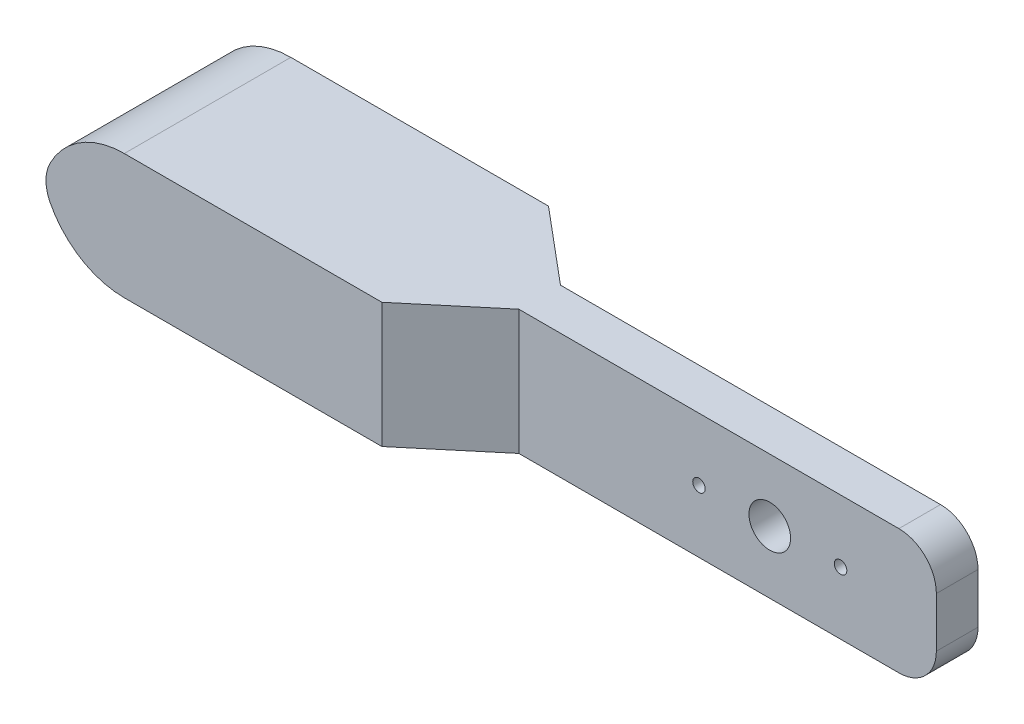
ISO-10303-21;
HEADER;
FILE_DESCRIPTION(('STEP AP214'),'2;1');
FILE_NAME('part.step','',(''),(''),'','','');
FILE_SCHEMA(('AUTOMOTIVE_DESIGN { 1 0 10303 214 1 1 1 1 }'));
ENDSEC;
DATA;
#1=APPLICATION_CONTEXT('core data for automotive mechanical design processes');
#2=APPLICATION_PROTOCOL_DEFINITION('international standard','automotive_design',2000,#1);
#3=PRODUCT_CONTEXT('',#1,'mechanical');
#4=PRODUCT('Part','Part','',(#3));
#5=PRODUCT_RELATED_PRODUCT_CATEGORY('part','',(#4));
#6=PRODUCT_DEFINITION_FORMATION('','',#4);
#7=PRODUCT_DEFINITION_CONTEXT('part definition',#1,'design');
#8=PRODUCT_DEFINITION('design','',#6,#7);
#9=PRODUCT_DEFINITION_SHAPE('','',#8);
#10=(LENGTH_UNIT() NAMED_UNIT(*) SI_UNIT(.MILLI.,.METRE.));
#11=(NAMED_UNIT(*) PLANE_ANGLE_UNIT() SI_UNIT($,.RADIAN.));
#12=(NAMED_UNIT(*) SI_UNIT($,.STERADIAN.) SOLID_ANGLE_UNIT());
#13=UNCERTAINTY_MEASURE_WITH_UNIT(LENGTH_MEASURE(1.E-05),#10,'distance_accuracy_value','');
#14=(GEOMETRIC_REPRESENTATION_CONTEXT(3) GLOBAL_UNCERTAINTY_ASSIGNED_CONTEXT((#13)) GLOBAL_UNIT_ASSIGNED_CONTEXT((#10,
#11,#12)) REPRESENTATION_CONTEXT('',''));
#15=CARTESIAN_POINT('',(0.,0.,0.));
#16=DIRECTION('',(0.,0.,1.));
#17=DIRECTION('',(1.,0.,0.));
#18=AXIS2_PLACEMENT_3D('',#15,#16,#17);
#19=CARTESIAN_POINT('',(0.,-6.,3.));
#20=DIRECTION('',(0.,-1.,0.));
#21=DIRECTION('',(0.,0.,1.));
#22=AXIS2_PLACEMENT_3D('',#19,#20,#21);
#23=PLANE('',#22);
#24=DIRECTION('',(1.,0.,0.));
#25=VECTOR('',#24,1.);
#26=CARTESIAN_POINT('',(0.,-6.,3.));
#27=LINE('',#26,#25);
#28=CARTESIAN_POINT('',(-27.629905537051,-6.,3.));
#29=VERTEX_POINT('',#28);
#30=CARTESIAN_POINT('',(18.,-6.,3.));
#31=VERTEX_POINT('',#30);
#32=EDGE_CURVE('E149',#29,#31,#27,.T.);
#33=ORIENTED_EDGE('',*,*,#32,.F.);
#34=DIRECTION('',(0.766044443118981,0.,-0.642787609686536));
#35=VECTOR('',#34,1.);
#36=CARTESIAN_POINT('',(-11.4160113957162,-6.,-10.6050725939414));
#37=LINE('',#36,#35);
#38=CARTESIAN_POINT('',(-36.5680574815077,-6.,10.5));
#39=VERTEX_POINT('',#38);
#40=EDGE_CURVE('E127',#39,#29,#37,.T.);
#41=ORIENTED_EDGE('',*,*,#40,.F.);
#42=DIRECTION('',(1.,0.,0.));
#43=VECTOR('',#42,1.);
#44=CARTESIAN_POINT('',(-77.5,-6.,10.5));
#45=LINE('',#44,#43);
#46=CARTESIAN_POINT('',(-67.5,-6.,10.5));
#47=VERTEX_POINT('',#46);
#48=EDGE_CURVE('E138',#47,#39,#45,.T.);
#49=ORIENTED_EDGE('',*,*,#48,.F.);
#50=DIRECTION('',(0.,0.,-1.));
#51=VECTOR('',#50,1.);
#52=CARTESIAN_POINT('',(-67.5,-6.,10.5));
#53=LINE('',#52,#51);
#54=CARTESIAN_POINT('',(-67.5,-6.,-9.5));
#55=VERTEX_POINT('',#54);
#56=EDGE_CURVE('E175',#55,#47,#53,.F.);
#57=ORIENTED_EDGE('',*,*,#56,.F.);
#58=DIRECTION('',(1.,0.,0.));
#59=VECTOR('',#58,1.);
#60=CARTESIAN_POINT('',(-77.5,-6.,-9.5));
#61=LINE('',#60,#59);
#62=CARTESIAN_POINT('',(-36.5680574815077,-6.,-9.5));
#63=VERTEX_POINT('',#62);
#64=EDGE_CURVE('E145',#55,#63,#61,.T.);
#65=ORIENTED_EDGE('',*,*,#64,.T.);
#66=DIRECTION('',(-0.766044443118981,0.,-0.642787609686536));
#67=VECTOR('',#66,1.);
#68=CARTESIAN_POINT('',(-8.9539920131857,-6.,13.670952149774));
#69=LINE('',#68,#67);
#70=CARTESIAN_POINT('',(-27.629905537051,-6.,-2.));
#71=VERTEX_POINT('',#70);
#72=EDGE_CURVE('E134',#71,#63,#69,.T.);
#73=ORIENTED_EDGE('',*,*,#72,.F.);
#74=DIRECTION('',(1.,0.,0.));
#75=VECTOR('',#74,1.);
#76=CARTESIAN_POINT('',(-17.5,-6.,-2.));
#77=LINE('',#76,#75);
#78=CARTESIAN_POINT('',(18.,-6.,-2.));
#79=VERTEX_POINT('',#78);
#80=EDGE_CURVE('E223',#71,#79,#77,.T.);
#81=ORIENTED_EDGE('',*,*,#80,.T.);
#82=DIRECTION('',(0.,0.,-1.));
#83=VECTOR('',#82,1.);
#84=CARTESIAN_POINT('',(18.,-6.,3.));
#85=LINE('',#84,#83);
#86=EDGE_CURVE('E177',#31,#79,#85,.T.);
#87=ORIENTED_EDGE('',*,*,#86,.F.);
#88=EDGE_LOOP('',(#33,#41,#49,#57,#65,#73,#81,#87));
#89=FACE_BOUND('',#88,.T.);
#90=ADVANCED_FACE('F37',(#89),#23,.T.);
#91=CARTESIAN_POINT('',(0.,9.,3.));
#92=DIRECTION('',(0.,-1.,0.));
#93=DIRECTION('',(0.,0.,1.));
#94=AXIS2_PLACEMENT_3D('',#91,#92,#93);
#95=PLANE('',#94);
#96=DIRECTION('',(-1.,0.,0.));
#97=VECTOR('',#96,1.);
#98=CARTESIAN_POINT('',(-17.5,9.,-2.));
#99=LINE('',#98,#97);
#100=CARTESIAN_POINT('',(18.,9.,-2.));
#101=VERTEX_POINT('',#100);
#102=CARTESIAN_POINT('',(-27.629905537051,9.,-2.));
#103=VERTEX_POINT('',#102);
#104=EDGE_CURVE('E232',#101,#103,#99,.T.);
#105=ORIENTED_EDGE('',*,*,#104,.T.);
#106=DIRECTION('',(0.766044443118981,0.,0.642787609686536));
#107=VECTOR('',#106,1.);
#108=CARTESIAN_POINT('',(-36.5680574815077,9.,-9.5));
#109=LINE('',#108,#107);
#110=CARTESIAN_POINT('',(-36.5680574815077,9.,-9.5));
#111=VERTEX_POINT('',#110);
#112=EDGE_CURVE('E150',#111,#103,#109,.T.);
#113=ORIENTED_EDGE('',*,*,#112,.F.);
#114=DIRECTION('',(1.,0.,0.));
#115=VECTOR('',#114,1.);
#116=CARTESIAN_POINT('',(-77.5,9.,-9.5));
#117=LINE('',#116,#115);
#118=CARTESIAN_POINT('',(-67.5,9.,-9.5));
#119=VERTEX_POINT('',#118);
#120=EDGE_CURVE('E209',#119,#111,#117,.T.);
#121=ORIENTED_EDGE('',*,*,#120,.F.);
#122=DIRECTION('',(0.,0.,1.));
#123=VECTOR('',#122,1.);
#124=CARTESIAN_POINT('',(-67.5,9.,3.));
#125=LINE('',#124,#123);
#126=CARTESIAN_POINT('',(-67.5,9.,10.5));
#127=VERTEX_POINT('',#126);
#128=EDGE_CURVE('E167',#127,#119,#125,.F.);
#129=ORIENTED_EDGE('',*,*,#128,.F.);
#130=DIRECTION('',(1.,0.,0.));
#131=VECTOR('',#130,1.);
#132=CARTESIAN_POINT('',(-77.5,9.,10.5));
#133=LINE('',#132,#131);
#134=CARTESIAN_POINT('',(-36.5680574815077,9.,10.5));
#135=VERTEX_POINT('',#134);
#136=EDGE_CURVE('E212',#127,#135,#133,.T.);
#137=ORIENTED_EDGE('',*,*,#136,.T.);
#138=DIRECTION('',(-0.766044443118981,0.,0.642787609686536));
#139=VECTOR('',#138,1.);
#140=CARTESIAN_POINT('',(-36.5680574815077,9.,10.5));
#141=LINE('',#140,#139);
#142=CARTESIAN_POINT('',(-27.629905537051,9.,3.));
#143=VERTEX_POINT('',#142);
#144=EDGE_CURVE('E130',#143,#135,#141,.T.);
#145=ORIENTED_EDGE('',*,*,#144,.F.);
#146=DIRECTION('',(1.,0.,0.));
#147=VECTOR('',#146,1.);
#148=CARTESIAN_POINT('',(0.,9.,3.));
#149=LINE('',#148,#147);
#150=CARTESIAN_POINT('',(18.,9.,3.));
#151=VERTEX_POINT('',#150);
#152=EDGE_CURVE('E135',#143,#151,#149,.T.);
#153=ORIENTED_EDGE('',*,*,#152,.T.);
#154=DIRECTION('',(0.,0.,-1.));
#155=VECTOR('',#154,1.);
#156=CARTESIAN_POINT('',(18.,9.,3.));
#157=LINE('',#156,#155);
#158=EDGE_CURVE('E194',#101,#151,#157,.F.);
#159=ORIENTED_EDGE('',*,*,#158,.F.);
#160=EDGE_LOOP('',(#105,#113,#121,#129,#137,#145,#153,#159));
#161=FACE_BOUND('',#160,.T.);
#162=ADVANCED_FACE('F243',(#161),#95,.F.);
#163=CARTESIAN_POINT('',(22.5,0.,3.));
#164=DIRECTION('',(1.,0.,0.));
#165=DIRECTION('',(0.,0.,1.));
#166=AXIS2_PLACEMENT_3D('',#163,#164,#165);
#167=PLANE('',#166);
#168=DIRECTION('',(0.,1.,0.));
#169=VECTOR('',#168,1.);
#170=CARTESIAN_POINT('',(22.5,-6.,-2.));
#171=LINE('',#170,#169);
#172=CARTESIAN_POINT('',(22.5,-1.5,-2.));
#173=VERTEX_POINT('',#172);
#174=CARTESIAN_POINT('',(22.5,4.5,-2.));
#175=VERTEX_POINT('',#174);
#176=EDGE_CURVE('E229',#173,#175,#171,.T.);
#177=ORIENTED_EDGE('',*,*,#176,.T.);
#178=DIRECTION('',(0.,0.,-1.));
#179=VECTOR('',#178,1.);
#180=CARTESIAN_POINT('',(22.5,4.5,-2.));
#181=LINE('',#180,#179);
#182=CARTESIAN_POINT('',(22.5,4.5,3.));
#183=VERTEX_POINT('',#182);
#184=EDGE_CURVE('E184',#183,#175,#181,.T.);
#185=ORIENTED_EDGE('',*,*,#184,.F.);
#186=DIRECTION('',(0.,1.,0.));
#187=VECTOR('',#186,1.);
#188=CARTESIAN_POINT('',(22.5,0.,3.));
#189=LINE('',#188,#187);
#190=CARTESIAN_POINT('',(22.5,-1.5,3.));
#191=VERTEX_POINT('',#190);
#192=EDGE_CURVE('E236',#191,#183,#189,.T.);
#193=ORIENTED_EDGE('',*,*,#192,.F.);
#194=DIRECTION('',(0.,0.,-1.));
#195=VECTOR('',#194,1.);
#196=CARTESIAN_POINT('',(22.5,-1.5,3.));
#197=LINE('',#196,#195);
#198=EDGE_CURVE('E187',#173,#191,#197,.F.);
#199=ORIENTED_EDGE('',*,*,#198,.F.);
#200=EDGE_LOOP('',(#177,#185,#193,#199));
#201=FACE_BOUND('',#200,.T.);
#202=ADVANCED_FACE('F288',(#201),#167,.T.);
#203=CARTESIAN_POINT('',(0.,0.,3.));
#204=DIRECTION('',(0.,0.,-1.));
#205=DIRECTION('',(1.,0.,0.));
#206=AXIS2_PLACEMENT_3D('',#203,#204,#205);
#207=PLANE('',#206);
#208=CARTESIAN_POINT('',(11.,1.5,3.));
#209=DIRECTION('',(0.,0.,1.));
#210=DIRECTION('',(1.,0.,0.));
#211=AXIS2_PLACEMENT_3D('',#208,#209,#210);
#212=CIRCLE('',#211,0.75);
#213=CARTESIAN_POINT('',(11.75,1.5,3.));
#214=VERTEX_POINT('',#213);
#215=EDGE_CURVE('E265',#214,#214,#212,.F.);
#216=ORIENTED_EDGE('',*,*,#215,.T.);
#217=EDGE_LOOP('',(#216));
#218=FACE_BOUND('',#217,.T.);
#219=CARTESIAN_POINT('',(2.5,1.5,3.));
#220=DIRECTION('',(0.,0.,1.));
#221=DIRECTION('',(1.,0.,0.));
#222=AXIS2_PLACEMENT_3D('',#219,#220,#221);
#223=CIRCLE('',#222,2.5);
#224=CARTESIAN_POINT('',(5.,1.5,3.));
#225=VERTEX_POINT('',#224);
#226=EDGE_CURVE('E216',#225,#225,#223,.F.);
#227=ORIENTED_EDGE('',*,*,#226,.T.);
#228=EDGE_LOOP('',(#227));
#229=FACE_BOUND('',#228,.T.);
#230=CARTESIAN_POINT('',(-6.,1.5,3.));
#231=DIRECTION('',(0.,0.,1.));
#232=DIRECTION('',(1.,0.,0.));
#233=AXIS2_PLACEMENT_3D('',#230,#231,#232);
#234=CIRCLE('',#233,0.75);
#235=CARTESIAN_POINT('',(-5.25,1.5,3.));
#236=VERTEX_POINT('',#235);
#237=EDGE_CURVE('E144',#236,#236,#234,.F.);
#238=ORIENTED_EDGE('',*,*,#237,.T.);
#239=EDGE_LOOP('',(#238));
#240=FACE_BOUND('',#239,.T.);
#241=ORIENTED_EDGE('',*,*,#192,.T.);
#242=CARTESIAN_POINT('',(18.,4.5,3.));
#243=DIRECTION('',(0.,0.,1.));
#244=DIRECTION('',(1.,0.,0.));
#245=AXIS2_PLACEMENT_3D('',#242,#243,#244);
#246=CIRCLE('',#245,4.5);
#247=EDGE_CURVE('E190',#151,#183,#246,.F.);
#248=ORIENTED_EDGE('',*,*,#247,.F.);
#249=ORIENTED_EDGE('',*,*,#152,.F.);
#250=DIRECTION('',(0.,1.,0.));
#251=VECTOR('',#250,1.);
#252=CARTESIAN_POINT('',(-27.629905537051,0.,3.));
#253=LINE('',#252,#251);
#254=EDGE_CURVE('E160',#29,#143,#253,.T.);
#255=ORIENTED_EDGE('',*,*,#254,.F.);
#256=ORIENTED_EDGE('',*,*,#32,.T.);
#257=CARTESIAN_POINT('',(18.,-1.5,3.));
#258=DIRECTION('',(0.,0.,1.));
#259=DIRECTION('',(1.,0.,0.));
#260=AXIS2_PLACEMENT_3D('',#257,#258,#259);
#261=CIRCLE('',#260,4.5);
#262=EDGE_CURVE('E192',#191,#31,#261,.F.);
#263=ORIENTED_EDGE('',*,*,#262,.F.);
#264=EDGE_LOOP('',(#241,#248,#249,#255,#256,#263));
#265=FACE_BOUND('',#264,.T.);
#266=ADVANCED_FACE('F246',(#218,#229,#240,#265),#207,.F.);
#267=CARTESIAN_POINT('',(0.,0.,-2.));
#268=DIRECTION('',(0.,0.,1.));
#269=DIRECTION('',(-1.,0.,0.));
#270=AXIS2_PLACEMENT_3D('',#267,#268,#269);
#271=PLANE('',#270);
#272=CARTESIAN_POINT('',(11.,1.5,-2.));
#273=DIRECTION('',(0.,0.,-1.));
#274=DIRECTION('',(-1.,0.,0.));
#275=AXIS2_PLACEMENT_3D('',#272,#273,#274);
#276=CIRCLE('',#275,0.75);
#277=CARTESIAN_POINT('',(10.25,1.5,-2.));
#278=VERTEX_POINT('',#277);
#279=EDGE_CURVE('E263',#278,#278,#276,.T.);
#280=ORIENTED_EDGE('',*,*,#279,.F.);
#281=EDGE_LOOP('',(#280));
#282=FACE_BOUND('',#281,.T.);
#283=CARTESIAN_POINT('',(2.5,1.5,-2.));
#284=DIRECTION('',(0.,0.,-1.));
#285=DIRECTION('',(-1.,0.,0.));
#286=AXIS2_PLACEMENT_3D('',#283,#284,#285);
#287=CIRCLE('',#286,2.5);
#288=CARTESIAN_POINT('',(0.,1.5,-2.));
#289=VERTEX_POINT('',#288);
#290=EDGE_CURVE('E219',#289,#289,#287,.T.);
#291=ORIENTED_EDGE('',*,*,#290,.F.);
#292=EDGE_LOOP('',(#291));
#293=FACE_BOUND('',#292,.T.);
#294=CARTESIAN_POINT('',(-6.,1.5,-2.));
#295=DIRECTION('',(0.,0.,-1.));
#296=DIRECTION('',(-1.,0.,0.));
#297=AXIS2_PLACEMENT_3D('',#294,#295,#296);
#298=CIRCLE('',#297,0.75);
#299=CARTESIAN_POINT('',(-6.75,1.5,-2.));
#300=VERTEX_POINT('',#299);
#301=EDGE_CURVE('E220',#300,#300,#298,.T.);
#302=ORIENTED_EDGE('',*,*,#301,.F.);
#303=EDGE_LOOP('',(#302));
#304=FACE_BOUND('',#303,.T.);
#305=ORIENTED_EDGE('',*,*,#80,.F.);
#306=DIRECTION('',(0.,-1.,0.));
#307=VECTOR('',#306,1.);
#308=CARTESIAN_POINT('',(-27.629905537051,0.,-2.));
#309=LINE('',#308,#307);
#310=EDGE_CURVE('E162',#103,#71,#309,.T.);
#311=ORIENTED_EDGE('',*,*,#310,.F.);
#312=ORIENTED_EDGE('',*,*,#104,.F.);
#313=CARTESIAN_POINT('',(18.,4.5,-2.));
#314=DIRECTION('',(0.,0.,-1.));
#315=DIRECTION('',(-1.,0.,0.));
#316=AXIS2_PLACEMENT_3D('',#313,#314,#315);
#317=CIRCLE('',#316,4.5);
#318=EDGE_CURVE('E180',#175,#101,#317,.F.);
#319=ORIENTED_EDGE('',*,*,#318,.F.);
#320=ORIENTED_EDGE('',*,*,#176,.F.);
#321=CARTESIAN_POINT('',(18.,-1.5,-2.));
#322=DIRECTION('',(0.,0.,-1.));
#323=DIRECTION('',(-1.,0.,0.));
#324=AXIS2_PLACEMENT_3D('',#321,#322,#323);
#325=CIRCLE('',#324,4.5);
#326=EDGE_CURVE('E182',#79,#173,#325,.F.);
#327=ORIENTED_EDGE('',*,*,#326,.F.);
#328=EDGE_LOOP('',(#305,#311,#312,#319,#320,#327));
#329=FACE_BOUND('',#328,.T.);
#330=ADVANCED_FACE('F254',(#282,#293,#304,#329),#271,.F.);
#331=CARTESIAN_POINT('',(-6.,1.5,-9.07106781186548));
#332=DIRECTION('',(0.,0.,1.));
#333=DIRECTION('',(-1.,0.,0.));
#334=AXIS2_PLACEMENT_3D('',#331,#332,#333);
#335=CYLINDRICAL_SURFACE('',#334,0.75);
#336=ORIENTED_EDGE('',*,*,#301,.T.);
#337=EDGE_LOOP('',(#336));
#338=FACE_BOUND('',#337,.T.);
#339=ORIENTED_EDGE('',*,*,#237,.F.);
#340=EDGE_LOOP('',(#339));
#341=FACE_BOUND('',#340,.T.);
#342=ADVANCED_FACE('F314',(#338,#341),#335,.F.);
#343=CARTESIAN_POINT('',(2.5,1.5,-9.07106781186548));
#344=DIRECTION('',(0.,0.,1.));
#345=DIRECTION('',(-1.,0.,0.));
#346=AXIS2_PLACEMENT_3D('',#343,#344,#345);
#347=CYLINDRICAL_SURFACE('',#346,2.5);
#348=ORIENTED_EDGE('',*,*,#290,.T.);
#349=EDGE_LOOP('',(#348));
#350=FACE_BOUND('',#349,.T.);
#351=ORIENTED_EDGE('',*,*,#226,.F.);
#352=EDGE_LOOP('',(#351));
#353=FACE_BOUND('',#352,.T.);
#354=ADVANCED_FACE('F320',(#350,#353),#347,.F.);
#355=CARTESIAN_POINT('',(-77.5,-6.,10.5));
#356=DIRECTION('',(0.,0.,-1.));
#357=DIRECTION('',(0.,-1.,0.));
#358=AXIS2_PLACEMENT_3D('',#355,#356,#357);
#359=PLANE('',#358);
#360=CARTESIAN_POINT('',(-67.5,4.,10.5));
#361=DIRECTION('',(0.,0.,1.));
#362=DIRECTION('',(0.,-1.,0.));
#363=AXIS2_PLACEMENT_3D('',#360,#361,#362);
#364=CIRCLE('',#363,10.);
#365=CARTESIAN_POINT('',(-76.4072354283025,-0.545454545454543,10.5));
#366=VERTEX_POINT('',#365);
#367=EDGE_CURVE('E140',#47,#366,#364,.F.);
#368=ORIENTED_EDGE('',*,*,#367,.F.);
#369=ORIENTED_EDGE('',*,*,#48,.T.);
#370=DIRECTION('',(0.,-1.,0.));
#371=VECTOR('',#370,1.);
#372=CARTESIAN_POINT('',(-36.5680574815077,-6.,10.5));
#373=LINE('',#372,#371);
#374=EDGE_CURVE('E123',#135,#39,#373,.T.);
#375=ORIENTED_EDGE('',*,*,#374,.F.);
#376=ORIENTED_EDGE('',*,*,#136,.F.);
#377=CARTESIAN_POINT('',(-67.5,-0.999999999999999,10.5));
#378=DIRECTION('',(0.,0.,1.));
#379=DIRECTION('',(0.,-1.,0.));
#380=AXIS2_PLACEMENT_3D('',#377,#378,#379);
#381=CIRCLE('',#380,10.);
#382=CARTESIAN_POINT('',(-76.4072354283025,3.54545454545455,10.5));
#383=VERTEX_POINT('',#382);
#384=EDGE_CURVE('E165',#383,#127,#381,.F.);
#385=ORIENTED_EDGE('',*,*,#384,.F.);
#386=CARTESIAN_POINT('',(-72.3989794855664,1.5,10.5));
#387=DIRECTION('',(0.,0.,1.));
#388=DIRECTION('',(0.,-1.,0.));
#389=AXIS2_PLACEMENT_3D('',#386,#387,#388);
#390=CIRCLE('',#389,4.5);
#391=EDGE_CURVE('E11',#366,#383,#390,.F.);
#392=ORIENTED_EDGE('',*,*,#391,.F.);
#393=EDGE_LOOP('',(#368,#369,#375,#376,#385,#392));
#394=FACE_BOUND('',#393,.T.);
#395=ADVANCED_FACE('F139',(#394),#359,.F.);
#396=CARTESIAN_POINT('',(-77.5,-6.,-9.5));
#397=DIRECTION('',(0.,0.,1.));
#398=DIRECTION('',(0.,1.,0.));
#399=AXIS2_PLACEMENT_3D('',#396,#397,#398);
#400=PLANE('',#399);
#401=CARTESIAN_POINT('',(-67.5,-0.999999999999999,-9.5));
#402=DIRECTION('',(0.,0.,-1.));
#403=DIRECTION('',(0.,1.,0.));
#404=AXIS2_PLACEMENT_3D('',#401,#402,#403);
#405=CIRCLE('',#404,10.);
#406=CARTESIAN_POINT('',(-76.4072354283025,3.54545454545455,-9.5));
#407=VERTEX_POINT('',#406);
#408=EDGE_CURVE('E172',#119,#407,#405,.F.);
#409=ORIENTED_EDGE('',*,*,#408,.F.);
#410=ORIENTED_EDGE('',*,*,#120,.T.);
#411=DIRECTION('',(0.,1.,0.));
#412=VECTOR('',#411,1.);
#413=CARTESIAN_POINT('',(-36.5680574815077,9.,-9.5));
#414=LINE('',#413,#412);
#415=EDGE_CURVE('E158',#63,#111,#414,.T.);
#416=ORIENTED_EDGE('',*,*,#415,.F.);
#417=ORIENTED_EDGE('',*,*,#64,.F.);
#418=CARTESIAN_POINT('',(-67.5,4.,-9.5));
#419=DIRECTION('',(0.,0.,-1.));
#420=DIRECTION('',(0.,1.,0.));
#421=AXIS2_PLACEMENT_3D('',#418,#419,#420);
#422=CIRCLE('',#421,10.);
#423=CARTESIAN_POINT('',(-76.4072354283025,-0.545454545454543,-9.5));
#424=VERTEX_POINT('',#423);
#425=EDGE_CURVE('E170',#424,#55,#422,.F.);
#426=ORIENTED_EDGE('',*,*,#425,.F.);
#427=CARTESIAN_POINT('',(-72.3989794855664,1.5,-9.5));
#428=DIRECTION('',(0.,0.,-1.));
#429=DIRECTION('',(0.,1.,0.));
#430=AXIS2_PLACEMENT_3D('',#427,#428,#429);
#431=CIRCLE('',#430,4.5);
#432=EDGE_CURVE('E199',#407,#424,#431,.F.);
#433=ORIENTED_EDGE('',*,*,#432,.F.);
#434=EDGE_LOOP('',(#409,#410,#416,#417,#426,#433));
#435=FACE_BOUND('',#434,.T.);
#436=ADVANCED_FACE('F204',(#435),#400,.F.);
#437=CARTESIAN_POINT('',(-36.5680574815077,-6.,10.5));
#438=DIRECTION('',(0.642787609686536,0.,0.766044443118981));
#439=DIRECTION('',(0.,1.,0.));
#440=AXIS2_PLACEMENT_3D('',#437,#438,#439);
#441=PLANE('',#440);
#442=ORIENTED_EDGE('',*,*,#144,.T.);
#443=ORIENTED_EDGE('',*,*,#374,.T.);
#444=ORIENTED_EDGE('',*,*,#40,.T.);
#445=ORIENTED_EDGE('',*,*,#254,.T.);
#446=EDGE_LOOP('',(#442,#443,#444,#445));
#447=FACE_BOUND('',#446,.T.);
#448=ADVANCED_FACE('F125',(#447),#441,.T.);
#449=CARTESIAN_POINT('',(-36.5680574815077,-6.,-9.5));
#450=DIRECTION('',(0.642787609686536,0.,-0.766044443118981));
#451=DIRECTION('',(0.,-1.,0.));
#452=AXIS2_PLACEMENT_3D('',#449,#450,#451);
#453=PLANE('',#452);
#454=ORIENTED_EDGE('',*,*,#72,.T.);
#455=ORIENTED_EDGE('',*,*,#415,.T.);
#456=ORIENTED_EDGE('',*,*,#112,.T.);
#457=ORIENTED_EDGE('',*,*,#310,.T.);
#458=EDGE_LOOP('',(#454,#455,#456,#457));
#459=FACE_BOUND('',#458,.T.);
#460=ADVANCED_FACE('F259',(#459),#453,.T.);
#461=CARTESIAN_POINT('',(-67.5,4.,0.));
#462=DIRECTION('',(0.,0.,1.));
#463=DIRECTION('',(-1.,0.,0.));
#464=AXIS2_PLACEMENT_3D('',#461,#462,#463);
#465=CYLINDRICAL_SURFACE('',#464,10.);
#466=ORIENTED_EDGE('',*,*,#425,.T.);
#467=ORIENTED_EDGE('',*,*,#56,.T.);
#468=ORIENTED_EDGE('',*,*,#367,.T.);
#469=DIRECTION('',(0.,0.,1.));
#470=VECTOR('',#469,1.);
#471=CARTESIAN_POINT('',(-76.4072354283025,-0.545454545454543,0.));
#472=LINE('',#471,#470);
#473=EDGE_CURVE('E45',#424,#366,#472,.T.);
#474=ORIENTED_EDGE('',*,*,#473,.F.);
#475=EDGE_LOOP('',(#466,#467,#468,#474));
#476=FACE_BOUND('',#475,.T.);
#477=ADVANCED_FACE('F206',(#476),#465,.T.);
#478=CARTESIAN_POINT('',(-67.5,-0.999999999999999,0.));
#479=DIRECTION('',(0.,0.,1.));
#480=DIRECTION('',(-1.,0.,0.));
#481=AXIS2_PLACEMENT_3D('',#478,#479,#480);
#482=CYLINDRICAL_SURFACE('',#481,10.);
#483=ORIENTED_EDGE('',*,*,#384,.T.);
#484=ORIENTED_EDGE('',*,*,#128,.T.);
#485=ORIENTED_EDGE('',*,*,#408,.T.);
#486=DIRECTION('',(0.,0.,1.));
#487=VECTOR('',#486,1.);
#488=CARTESIAN_POINT('',(-76.4072354283025,3.54545454545455,0.));
#489=LINE('',#488,#487);
#490=EDGE_CURVE('E197',#383,#407,#489,.F.);
#491=ORIENTED_EDGE('',*,*,#490,.F.);
#492=EDGE_LOOP('',(#483,#484,#485,#491));
#493=FACE_BOUND('',#492,.T.);
#494=ADVANCED_FACE('F261',(#493),#482,.T.);
#495=CARTESIAN_POINT('',(18.,-1.5,3.));
#496=DIRECTION('',(0.,0.,-1.));
#497=DIRECTION('',(1.,0.,0.));
#498=AXIS2_PLACEMENT_3D('',#495,#496,#497);
#499=CYLINDRICAL_SURFACE('',#498,4.5);
#500=ORIENTED_EDGE('',*,*,#262,.T.);
#501=ORIENTED_EDGE('',*,*,#86,.T.);
#502=ORIENTED_EDGE('',*,*,#326,.T.);
#503=ORIENTED_EDGE('',*,*,#198,.T.);
#504=EDGE_LOOP('',(#500,#501,#502,#503));
#505=FACE_BOUND('',#504,.T.);
#506=ADVANCED_FACE('F281',(#505),#499,.T.);
#507=CARTESIAN_POINT('',(18.,4.5,3.));
#508=DIRECTION('',(0.,0.,1.));
#509=DIRECTION('',(-1.,0.,0.));
#510=AXIS2_PLACEMENT_3D('',#507,#508,#509);
#511=CYLINDRICAL_SURFACE('',#510,4.5);
#512=ORIENTED_EDGE('',*,*,#247,.T.);
#513=ORIENTED_EDGE('',*,*,#184,.T.);
#514=ORIENTED_EDGE('',*,*,#318,.T.);
#515=ORIENTED_EDGE('',*,*,#158,.T.);
#516=EDGE_LOOP('',(#512,#513,#514,#515));
#517=FACE_BOUND('',#516,.T.);
#518=ADVANCED_FACE('F250',(#517),#511,.T.);
#519=CARTESIAN_POINT('',(11.,1.5,-9.07106781186548));
#520=DIRECTION('',(0.,0.,1.));
#521=DIRECTION('',(-1.,0.,0.));
#522=AXIS2_PLACEMENT_3D('',#519,#520,#521);
#523=CYLINDRICAL_SURFACE('',#522,0.75);
#524=ORIENTED_EDGE('',*,*,#279,.T.);
#525=EDGE_LOOP('',(#524));
#526=FACE_BOUND('',#525,.T.);
#527=ORIENTED_EDGE('',*,*,#215,.F.);
#528=EDGE_LOOP('',(#527));
#529=FACE_BOUND('',#528,.T.);
#530=ADVANCED_FACE('F273',(#526,#529),#523,.F.);
#531=CARTESIAN_POINT('',(-72.3989794855664,1.5,0.));
#532=DIRECTION('',(0.,0.,-1.));
#533=DIRECTION('',(1.,0.,0.));
#534=AXIS2_PLACEMENT_3D('',#531,#532,#533);
#535=CYLINDRICAL_SURFACE('',#534,4.5);
#536=ORIENTED_EDGE('',*,*,#391,.T.);
#537=ORIENTED_EDGE('',*,*,#490,.T.);
#538=ORIENTED_EDGE('',*,*,#432,.T.);
#539=ORIENTED_EDGE('',*,*,#473,.T.);
#540=EDGE_LOOP('',(#536,#537,#538,#539));
#541=FACE_BOUND('',#540,.T.);
#542=ADVANCED_FACE('F39',(#541),#535,.T.);
#543=CLOSED_SHELL('',(#90,#162,#202,#266,#330,#342,#354,#395,#436,#448,#460,#477,#494,#506,#518,
#530,#542));
#544=MANIFOLD_SOLID_BREP('B2',#543);
#545=ADVANCED_BREP_SHAPE_REPRESENTATION('',(#18,#544),#14);
#546=SHAPE_DEFINITION_REPRESENTATION(#9,#545);
ENDSEC;
END-ISO-10303-21;
